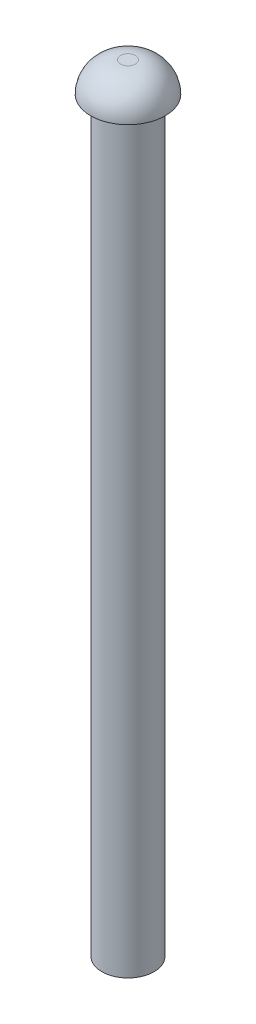
ISO-10303-21;
HEADER;
FILE_DESCRIPTION(('STEP AP214'),'2;1');
FILE_NAME('part.step','',(''),(''),'','','');
FILE_SCHEMA(('AUTOMOTIVE_DESIGN { 1 0 10303 214 1 1 1 1 }'));
ENDSEC;
DATA;
#1=APPLICATION_CONTEXT('core data for automotive mechanical design processes');
#2=APPLICATION_PROTOCOL_DEFINITION('international standard','automotive_design',2000,#1);
#3=PRODUCT_CONTEXT('',#1,'mechanical');
#4=PRODUCT('Part','Part','',(#3));
#5=PRODUCT_RELATED_PRODUCT_CATEGORY('part','',(#4));
#6=PRODUCT_DEFINITION_FORMATION('','',#4);
#7=PRODUCT_DEFINITION_CONTEXT('part definition',#1,'design');
#8=PRODUCT_DEFINITION('design','',#6,#7);
#9=PRODUCT_DEFINITION_SHAPE('','',#8);
#10=(LENGTH_UNIT() NAMED_UNIT(*) SI_UNIT(.MILLI.,.METRE.));
#11=(NAMED_UNIT(*) PLANE_ANGLE_UNIT() SI_UNIT($,.RADIAN.));
#12=(NAMED_UNIT(*) SI_UNIT($,.STERADIAN.) SOLID_ANGLE_UNIT());
#13=UNCERTAINTY_MEASURE_WITH_UNIT(LENGTH_MEASURE(1.E-05),#10,'distance_accuracy_value','');
#14=(GEOMETRIC_REPRESENTATION_CONTEXT(3) GLOBAL_UNCERTAINTY_ASSIGNED_CONTEXT((#13)) GLOBAL_UNIT_ASSIGNED_CONTEXT((#10,
#11,#12)) REPRESENTATION_CONTEXT('',''));
#15=CARTESIAN_POINT('',(0.,0.,0.));
#16=DIRECTION('',(0.,0.,1.));
#17=DIRECTION('',(1.,0.,0.));
#18=AXIS2_PLACEMENT_3D('',#15,#16,#17);
#19=CARTESIAN_POINT('',(0.,-100.,0.));
#20=DIRECTION('',(0.,1.,0.));
#21=DIRECTION('',(0.,0.,1.));
#22=AXIS2_PLACEMENT_3D('',#19,#20,#21);
#23=CYLINDRICAL_SURFACE('',#22,3.5);
#24=CARTESIAN_POINT('',(0.,-100.,0.));
#25=DIRECTION('',(0.,1.,0.));
#26=DIRECTION('',(0.,0.,1.));
#27=AXIS2_PLACEMENT_3D('',#24,#25,#26);
#28=CIRCLE('',#27,3.5);
#29=CARTESIAN_POINT('',(0.,-100.,3.5));
#30=VERTEX_POINT('',#29);
#31=EDGE_CURVE('E42',#30,#30,#28,.T.);
#32=ORIENTED_EDGE('',*,*,#31,.T.);
#33=EDGE_LOOP('',(#32));
#34=FACE_BOUND('',#33,.T.);
#35=CARTESIAN_POINT('',(0.,0.,0.));
#36=DIRECTION('',(0.,1.,0.));
#37=DIRECTION('',(0.,0.,1.));
#38=AXIS2_PLACEMENT_3D('',#35,#36,#37);
#39=CIRCLE('',#38,3.5);
#40=CARTESIAN_POINT('',(0.,0.,3.5));
#41=VERTEX_POINT('',#40);
#42=EDGE_CURVE('E48',#41,#41,#39,.T.);
#43=ORIENTED_EDGE('',*,*,#42,.F.);
#44=EDGE_LOOP('',(#43));
#45=FACE_BOUND('',#44,.T.);
#46=ADVANCED_FACE('F40',(#34,#45),#23,.T.);
#47=CARTESIAN_POINT('',(0.,-100.,0.));
#48=DIRECTION('',(0.,1.,0.));
#49=DIRECTION('',(0.,0.,1.));
#50=AXIS2_PLACEMENT_3D('',#47,#48,#49);
#51=PLANE('',#50);
#52=ORIENTED_EDGE('',*,*,#31,.F.);
#53=EDGE_LOOP('',(#52));
#54=FACE_BOUND('',#53,.T.);
#55=ADVANCED_FACE('F66',(#54),#51,.F.);
#56=CARTESIAN_POINT('',(0.,4.,0.));
#57=DIRECTION('',(0.,1.,0.));
#58=DIRECTION('',(0.,0.,1.));
#59=AXIS2_PLACEMENT_3D('',#56,#57,#58);
#60=PLANE('',#59);
#61=CARTESIAN_POINT('',(0.,4.,0.));
#62=DIRECTION('',(0.,1.,0.));
#63=DIRECTION('',(0.,0.,1.));
#64=AXIS2_PLACEMENT_3D('',#61,#62,#63);
#65=CIRCLE('',#64,1.);
#66=CARTESIAN_POINT('',(0.,4.,1.));
#67=VERTEX_POINT('',#66);
#68=EDGE_CURVE('E10',#67,#67,#65,.T.);
#69=ORIENTED_EDGE('',*,*,#68,.T.);
#70=EDGE_LOOP('',(#69));
#71=FACE_BOUND('',#70,.T.);
#72=ADVANCED_FACE('F65',(#71),#60,.T.);
#73=CARTESIAN_POINT('',(0.,0.,0.));
#74=DIRECTION('',(0.,1.,0.));
#75=DIRECTION('',(0.,0.,1.));
#76=AXIS2_PLACEMENT_3D('',#73,#74,#75);
#77=PLANE('',#76);
#78=ORIENTED_EDGE('',*,*,#42,.T.);
#79=EDGE_LOOP('',(#78));
#80=FACE_BOUND('',#79,.T.);
#81=CARTESIAN_POINT('',(0.,0.,0.));
#82=DIRECTION('',(0.,1.,0.));
#83=DIRECTION('',(0.,0.,1.));
#84=AXIS2_PLACEMENT_3D('',#81,#82,#83);
#85=CIRCLE('',#84,5.);
#86=CARTESIAN_POINT('',(0.,0.,5.));
#87=VERTEX_POINT('',#86);
#88=EDGE_CURVE('E52',#87,#87,#85,.T.);
#89=ORIENTED_EDGE('',*,*,#88,.F.);
#90=EDGE_LOOP('',(#89));
#91=FACE_BOUND('',#90,.T.);
#92=ADVANCED_FACE('F58',(#80,#91),#77,.F.);
#93=CARTESIAN_POINT('',(0.,0.,0.));
#94=DIRECTION('',(0.,1.,0.));
#95=DIRECTION('',(0.,0.,1.));
#96=AXIS2_PLACEMENT_3D('',#93,#94,#95);
#97=DEGENERATE_TOROIDAL_SURFACE('',#96,1.,4.,.T.);
#98=ORIENTED_EDGE('',*,*,#88,.T.);
#99=EDGE_LOOP('',(#98));
#100=FACE_BOUND('',#99,.T.);
#101=ORIENTED_EDGE('',*,*,#68,.F.);
#102=EDGE_LOOP('',(#101));
#103=FACE_BOUND('',#102,.T.);
#104=ADVANCED_FACE('F39',(#100,#103),#97,.T.);
#105=CLOSED_SHELL('',(#46,#55,#72,#92,#104));
#106=MANIFOLD_SOLID_BREP('B2',#105);
#107=ADVANCED_BREP_SHAPE_REPRESENTATION('',(#18,#106),#14);
#108=SHAPE_DEFINITION_REPRESENTATION(#9,#107);
ENDSEC;
END-ISO-10303-21;
